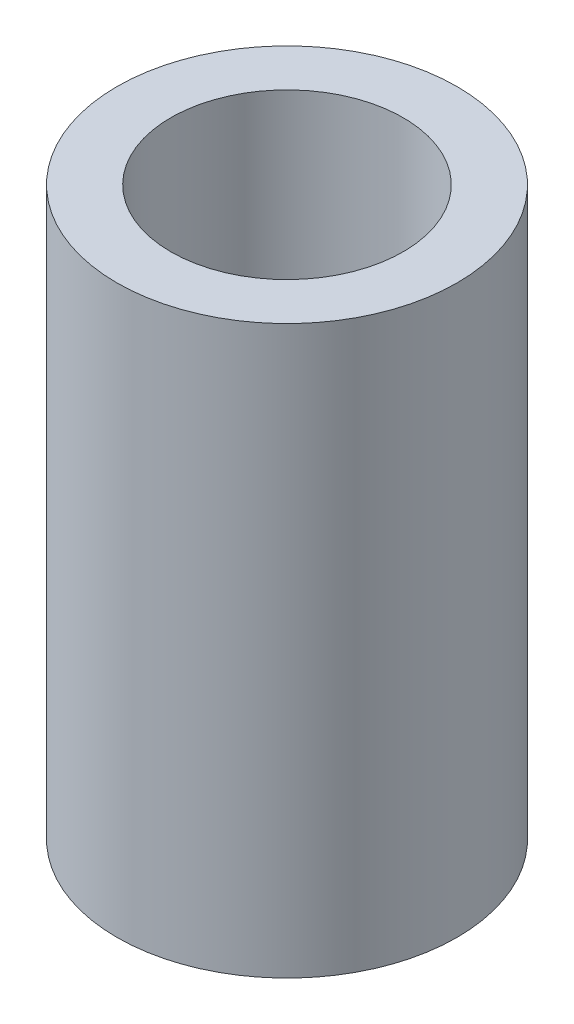
ISO-10303-21;
HEADER;
FILE_DESCRIPTION(('STEP AP214'),'2;1');
FILE_NAME('part.step','',(''),(''),'','','');
FILE_SCHEMA(('AUTOMOTIVE_DESIGN { 1 0 10303 214 1 1 1 1 }'));
ENDSEC;
DATA;
#1=APPLICATION_CONTEXT('core data for automotive mechanical design processes');
#2=APPLICATION_PROTOCOL_DEFINITION('international standard','automotive_design',2000,#1);
#3=PRODUCT_CONTEXT('',#1,'mechanical');
#4=PRODUCT('Part','Part','',(#3));
#5=PRODUCT_RELATED_PRODUCT_CATEGORY('part','',(#4));
#6=PRODUCT_DEFINITION_FORMATION('','',#4);
#7=PRODUCT_DEFINITION_CONTEXT('part definition',#1,'design');
#8=PRODUCT_DEFINITION('design','',#6,#7);
#9=PRODUCT_DEFINITION_SHAPE('','',#8);
#10=(LENGTH_UNIT() NAMED_UNIT(*) SI_UNIT(.MILLI.,.METRE.));
#11=(NAMED_UNIT(*) PLANE_ANGLE_UNIT() SI_UNIT($,.RADIAN.));
#12=(NAMED_UNIT(*) SI_UNIT($,.STERADIAN.) SOLID_ANGLE_UNIT());
#13=UNCERTAINTY_MEASURE_WITH_UNIT(LENGTH_MEASURE(1.E-05),#10,'distance_accuracy_value','');
#14=(GEOMETRIC_REPRESENTATION_CONTEXT(3) GLOBAL_UNCERTAINTY_ASSIGNED_CONTEXT((#13)) GLOBAL_UNIT_ASSIGNED_CONTEXT((#10,
#11,#12)) REPRESENTATION_CONTEXT('',''));
#15=CARTESIAN_POINT('',(0.,0.,0.));
#16=DIRECTION('',(0.,0.,1.));
#17=DIRECTION('',(1.,0.,0.));
#18=AXIS2_PLACEMENT_3D('',#15,#16,#17);
#19=CARTESIAN_POINT('',(0.,10.,0.));
#20=DIRECTION('',(0.,1.,0.));
#21=DIRECTION('',(0.,0.,1.));
#22=AXIS2_PLACEMENT_3D('',#19,#20,#21);
#23=PLANE('',#22);
#24=CARTESIAN_POINT('',(0.,10.,0.));
#25=DIRECTION('',(0.,1.,0.));
#26=DIRECTION('',(0.,0.,1.));
#27=AXIS2_PLACEMENT_3D('',#24,#25,#26);
#28=CIRCLE('',#27,3.);
#29=CARTESIAN_POINT('',(0.,10.,3.));
#30=VERTEX_POINT('',#29);
#31=EDGE_CURVE('E10',#30,#30,#28,.T.);
#32=ORIENTED_EDGE('',*,*,#31,.T.);
#33=EDGE_LOOP('',(#32));
#34=FACE_BOUND('',#33,.T.);
#35=CARTESIAN_POINT('',(0.,10.,0.));
#36=DIRECTION('',(0.,1.,0.));
#37=DIRECTION('',(0.,0.,1.));
#38=AXIS2_PLACEMENT_3D('',#35,#36,#37);
#39=CIRCLE('',#38,2.05);
#40=CARTESIAN_POINT('',(0.,10.,2.05));
#41=VERTEX_POINT('',#40);
#42=EDGE_CURVE('E42',#41,#41,#39,.T.);
#43=ORIENTED_EDGE('',*,*,#42,.F.);
#44=EDGE_LOOP('',(#43));
#45=FACE_BOUND('',#44,.T.);
#46=ADVANCED_FACE('F31',(#34,#45),#23,.T.);
#47=CARTESIAN_POINT('',(0.,0.,0.));
#48=DIRECTION('',(0.,1.,0.));
#49=DIRECTION('',(0.,0.,1.));
#50=AXIS2_PLACEMENT_3D('',#47,#48,#49);
#51=PLANE('',#50);
#52=CARTESIAN_POINT('',(0.,0.,0.));
#53=DIRECTION('',(0.,1.,0.));
#54=DIRECTION('',(0.,0.,1.));
#55=AXIS2_PLACEMENT_3D('',#52,#53,#54);
#56=CIRCLE('',#55,3.);
#57=CARTESIAN_POINT('',(0.,0.,3.));
#58=VERTEX_POINT('',#57);
#59=EDGE_CURVE('E35',#58,#58,#56,.T.);
#60=ORIENTED_EDGE('',*,*,#59,.F.);
#61=EDGE_LOOP('',(#60));
#62=FACE_BOUND('',#61,.T.);
#63=CARTESIAN_POINT('',(0.,0.,0.));
#64=DIRECTION('',(0.,1.,0.));
#65=DIRECTION('',(0.,0.,1.));
#66=AXIS2_PLACEMENT_3D('',#63,#64,#65);
#67=CIRCLE('',#66,2.05);
#68=CARTESIAN_POINT('',(0.,0.,2.05));
#69=VERTEX_POINT('',#68);
#70=EDGE_CURVE('E44',#69,#69,#67,.T.);
#71=ORIENTED_EDGE('',*,*,#70,.T.);
#72=EDGE_LOOP('',(#71));
#73=FACE_BOUND('',#72,.T.);
#74=ADVANCED_FACE('F54',(#62,#73),#51,.F.);
#75=CARTESIAN_POINT('',(0.,10.,0.));
#76=DIRECTION('',(0.,-1.,0.));
#77=DIRECTION('',(0.,0.,-1.));
#78=AXIS2_PLACEMENT_3D('',#75,#76,#77);
#79=CYLINDRICAL_SURFACE('',#78,3.);
#80=ORIENTED_EDGE('',*,*,#31,.F.);
#81=EDGE_LOOP('',(#80));
#82=FACE_BOUND('',#81,.T.);
#83=ORIENTED_EDGE('',*,*,#59,.T.);
#84=EDGE_LOOP('',(#83));
#85=FACE_BOUND('',#84,.T.);
#86=ADVANCED_FACE('F33',(#82,#85),#79,.T.);
#87=CARTESIAN_POINT('',(0.,10.,0.));
#88=DIRECTION('',(0.,-1.,0.));
#89=DIRECTION('',(0.,0.,-1.));
#90=AXIS2_PLACEMENT_3D('',#87,#88,#89);
#91=CYLINDRICAL_SURFACE('',#90,2.05);
#92=ORIENTED_EDGE('',*,*,#42,.T.);
#93=EDGE_LOOP('',(#92));
#94=FACE_BOUND('',#93,.T.);
#95=ORIENTED_EDGE('',*,*,#70,.F.);
#96=EDGE_LOOP('',(#95));
#97=FACE_BOUND('',#96,.T.);
#98=ADVANCED_FACE('F50',(#94,#97),#91,.F.);
#99=CLOSED_SHELL('',(#46,#74,#86,#98));
#100=MANIFOLD_SOLID_BREP('B2',#99);
#101=ADVANCED_BREP_SHAPE_REPRESENTATION('',(#18,#100),#14);
#102=SHAPE_DEFINITION_REPRESENTATION(#9,#101);
ENDSEC;
END-ISO-10303-21;
